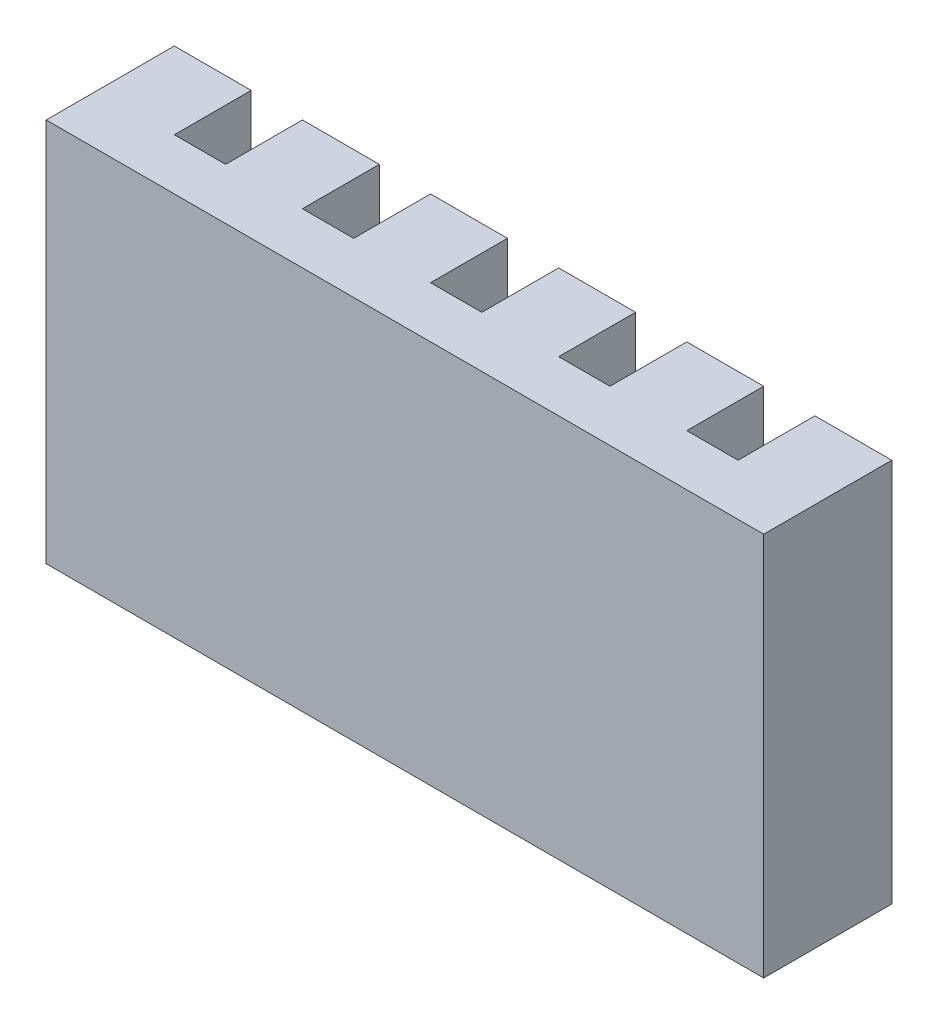
ISO-10303-21;
HEADER;
FILE_DESCRIPTION(('STEP AP214'),'2;1');
FILE_NAME('part.step','',(''),(''),'','','');
FILE_SCHEMA(('AUTOMOTIVE_DESIGN { 1 0 10303 214 1 1 1 1 }'));
ENDSEC;
DATA;
#1=APPLICATION_CONTEXT('core data for automotive mechanical design processes');
#2=APPLICATION_PROTOCOL_DEFINITION('international standard','automotive_design',2000,#1);
#3=PRODUCT_CONTEXT('',#1,'mechanical');
#4=PRODUCT('Part','Part','',(#3));
#5=PRODUCT_RELATED_PRODUCT_CATEGORY('part','',(#4));
#6=PRODUCT_DEFINITION_FORMATION('','',#4);
#7=PRODUCT_DEFINITION_CONTEXT('part definition',#1,'design');
#8=PRODUCT_DEFINITION('design','',#6,#7);
#9=PRODUCT_DEFINITION_SHAPE('','',#8);
#10=(LENGTH_UNIT() NAMED_UNIT(*) SI_UNIT(.MILLI.,.METRE.));
#11=(NAMED_UNIT(*) PLANE_ANGLE_UNIT() SI_UNIT($,.RADIAN.));
#12=(NAMED_UNIT(*) SI_UNIT($,.STERADIAN.) SOLID_ANGLE_UNIT());
#13=UNCERTAINTY_MEASURE_WITH_UNIT(LENGTH_MEASURE(1.E-05),#10,'distance_accuracy_value','');
#14=(GEOMETRIC_REPRESENTATION_CONTEXT(3) GLOBAL_UNCERTAINTY_ASSIGNED_CONTEXT((#13)) GLOBAL_UNIT_ASSIGNED_CONTEXT((#10,
#11,#12)) REPRESENTATION_CONTEXT('',''));
#15=CARTESIAN_POINT('',(0.,0.,0.));
#16=DIRECTION('',(0.,0.,1.));
#17=DIRECTION('',(1.,0.,0.));
#18=AXIS2_PLACEMENT_3D('',#15,#16,#17);
#19=CARTESIAN_POINT('',(14.,7.5,-5.));
#20=DIRECTION('',(0.,0.,1.));
#21=DIRECTION('',(1.,0.,0.));
#22=AXIS2_PLACEMENT_3D('',#19,#20,#21);
#23=PLANE('',#22);
#24=DIRECTION('',(-1.,0.,0.));
#25=VECTOR('',#24,1.);
#26=CARTESIAN_POINT('',(14.,-7.5,-5.));
#27=LINE('',#26,#25);
#28=CARTESIAN_POINT('',(14.,-7.5,-5.));
#29=VERTEX_POINT('',#28);
#30=CARTESIAN_POINT('',(11.,-7.5,-5.00000000000001));
#31=VERTEX_POINT('',#30);
#32=EDGE_CURVE('E233',#29,#31,#27,.T.);
#33=ORIENTED_EDGE('',*,*,#32,.T.);
#34=DIRECTION('',(0.,-1.,0.));
#35=VECTOR('',#34,1.);
#36=CARTESIAN_POINT('',(11.,7.5,-5.00000000000001));
#37=LINE('',#36,#35);
#38=CARTESIAN_POINT('',(11.,7.5,-5.00000000000001));
#39=VERTEX_POINT('',#38);
#40=EDGE_CURVE('E11',#39,#31,#37,.T.);
#41=ORIENTED_EDGE('',*,*,#40,.F.);
#42=DIRECTION('',(-1.,0.,0.));
#43=VECTOR('',#42,1.);
#44=CARTESIAN_POINT('',(14.,7.5,-5.));
#45=LINE('',#44,#43);
#46=CARTESIAN_POINT('',(14.,7.5,-5.));
#47=VERTEX_POINT('',#46);
#48=EDGE_CURVE('E279',#47,#39,#45,.T.);
#49=ORIENTED_EDGE('',*,*,#48,.F.);
#50=DIRECTION('',(0.,-1.,0.));
#51=VECTOR('',#50,1.);
#52=CARTESIAN_POINT('',(14.,7.5,-5.));
#53=LINE('',#52,#51);
#54=EDGE_CURVE('E229',#47,#29,#53,.T.);
#55=ORIENTED_EDGE('',*,*,#54,.T.);
#56=EDGE_LOOP('',(#33,#41,#49,#55));
#57=FACE_BOUND('',#56,.T.);
#58=ADVANCED_FACE('F41',(#57),#23,.F.);
#59=CARTESIAN_POINT('',(11.,7.5,-5.00000000000001));
#60=DIRECTION('',(1.,0.,0.));
#61=DIRECTION('',(0.,0.,-1.));
#62=AXIS2_PLACEMENT_3D('',#59,#60,#61);
#63=PLANE('',#62);
#64=DIRECTION('',(0.,0.,1.));
#65=VECTOR('',#64,1.);
#66=CARTESIAN_POINT('',(11.,-7.5,-5.00000000000001));
#67=LINE('',#66,#65);
#68=CARTESIAN_POINT('',(11.,-7.5,-2.00000000000001));
#69=VERTEX_POINT('',#68);
#70=EDGE_CURVE('E236',#31,#69,#67,.T.);
#71=ORIENTED_EDGE('',*,*,#70,.T.);
#72=DIRECTION('',(0.,-1.,0.));
#73=VECTOR('',#72,1.);
#74=CARTESIAN_POINT('',(11.,7.5,-2.00000000000001));
#75=LINE('',#74,#73);
#76=CARTESIAN_POINT('',(11.,7.5,-2.00000000000001));
#77=VERTEX_POINT('',#76);
#78=EDGE_CURVE('E49',#77,#69,#75,.T.);
#79=ORIENTED_EDGE('',*,*,#78,.F.);
#80=DIRECTION('',(0.,0.,1.));
#81=VECTOR('',#80,1.);
#82=CARTESIAN_POINT('',(11.,7.5,-5.00000000000001));
#83=LINE('',#82,#81);
#84=EDGE_CURVE('E148',#39,#77,#83,.T.);
#85=ORIENTED_EDGE('',*,*,#84,.F.);
#86=ORIENTED_EDGE('',*,*,#40,.T.);
#87=EDGE_LOOP('',(#71,#79,#85,#86));
#88=FACE_BOUND('',#87,.T.);
#89=ADVANCED_FACE('F417',(#88),#63,.F.);
#90=CARTESIAN_POINT('',(11.,7.5,-2.00000000000001));
#91=DIRECTION('',(0.,0.,1.));
#92=DIRECTION('',(1.,0.,0.));
#93=AXIS2_PLACEMENT_3D('',#90,#91,#92);
#94=PLANE('',#93);
#95=DIRECTION('',(-1.,0.,0.));
#96=VECTOR('',#95,1.);
#97=CARTESIAN_POINT('',(11.,-7.5,-2.00000000000001));
#98=LINE('',#97,#96);
#99=CARTESIAN_POINT('',(9.,-7.5,-2.));
#100=VERTEX_POINT('',#99);
#101=EDGE_CURVE('E238',#69,#100,#98,.T.);
#102=ORIENTED_EDGE('',*,*,#101,.T.);
#103=DIRECTION('',(0.,-1.,0.));
#104=VECTOR('',#103,1.);
#105=CARTESIAN_POINT('',(9.,7.5,-2.));
#106=LINE('',#105,#104);
#107=CARTESIAN_POINT('',(9.,7.5,-2.));
#108=VERTEX_POINT('',#107);
#109=EDGE_CURVE('E334',#108,#100,#106,.T.);
#110=ORIENTED_EDGE('',*,*,#109,.F.);
#111=DIRECTION('',(-1.,0.,0.));
#112=VECTOR('',#111,1.);
#113=CARTESIAN_POINT('',(11.,7.5,-2.00000000000001));
#114=LINE('',#113,#112);
#115=EDGE_CURVE('E342',#77,#108,#114,.T.);
#116=ORIENTED_EDGE('',*,*,#115,.F.);
#117=ORIENTED_EDGE('',*,*,#78,.T.);
#118=EDGE_LOOP('',(#102,#110,#116,#117));
#119=FACE_BOUND('',#118,.T.);
#120=ADVANCED_FACE('F340',(#119),#94,.F.);
#121=CARTESIAN_POINT('',(9.,7.5,-2.));
#122=DIRECTION('',(-1.,0.,0.));
#123=DIRECTION('',(0.,0.,1.));
#124=AXIS2_PLACEMENT_3D('',#121,#122,#123);
#125=PLANE('',#124);
#126=DIRECTION('',(0.,0.,-1.));
#127=VECTOR('',#126,1.);
#128=CARTESIAN_POINT('',(9.,-7.5,-2.));
#129=LINE('',#128,#127);
#130=CARTESIAN_POINT('',(9.,-7.5,-5.));
#131=VERTEX_POINT('',#130);
#132=EDGE_CURVE('E240',#100,#131,#129,.T.);
#133=ORIENTED_EDGE('',*,*,#132,.T.);
#134=DIRECTION('',(0.,-1.,0.));
#135=VECTOR('',#134,1.);
#136=CARTESIAN_POINT('',(9.,7.5,-5.));
#137=LINE('',#136,#135);
#138=CARTESIAN_POINT('',(9.,7.5,-5.));
#139=VERTEX_POINT('',#138);
#140=EDGE_CURVE('E331',#139,#131,#137,.T.);
#141=ORIENTED_EDGE('',*,*,#140,.F.);
#142=DIRECTION('',(0.,0.,-1.));
#143=VECTOR('',#142,1.);
#144=CARTESIAN_POINT('',(9.,7.5,-2.));
#145=LINE('',#144,#143);
#146=EDGE_CURVE('E360',#108,#139,#145,.T.);
#147=ORIENTED_EDGE('',*,*,#146,.F.);
#148=ORIENTED_EDGE('',*,*,#109,.T.);
#149=EDGE_LOOP('',(#133,#141,#147,#148));
#150=FACE_BOUND('',#149,.T.);
#151=ADVANCED_FACE('F351',(#150),#125,.F.);
#152=CARTESIAN_POINT('',(6.,7.5,-5.));
#153=DIRECTION('',(0.,0.,1.));
#154=DIRECTION('',(1.,0.,0.));
#155=AXIS2_PLACEMENT_3D('',#152,#153,#154);
#156=PLANE('',#155);
#157=DIRECTION('',(-1.,0.,0.));
#158=VECTOR('',#157,1.);
#159=CARTESIAN_POINT('',(6.,-7.5,-5.));
#160=LINE('',#159,#158);
#161=CARTESIAN_POINT('',(6.,-7.5,-5.));
#162=VERTEX_POINT('',#161);
#163=EDGE_CURVE('E242',#131,#162,#160,.T.);
#164=ORIENTED_EDGE('',*,*,#163,.T.);
#165=DIRECTION('',(0.,-1.,0.));
#166=VECTOR('',#165,1.);
#167=CARTESIAN_POINT('',(6.,7.5,-5.));
#168=LINE('',#167,#166);
#169=CARTESIAN_POINT('',(6.,7.5,-5.));
#170=VERTEX_POINT('',#169);
#171=EDGE_CURVE('E328',#170,#162,#168,.T.);
#172=ORIENTED_EDGE('',*,*,#171,.F.);
#173=DIRECTION('',(-1.,0.,0.));
#174=VECTOR('',#173,1.);
#175=CARTESIAN_POINT('',(6.,7.5,-5.));
#176=LINE('',#175,#174);
#177=EDGE_CURVE('E357',#139,#170,#176,.T.);
#178=ORIENTED_EDGE('',*,*,#177,.F.);
#179=ORIENTED_EDGE('',*,*,#140,.T.);
#180=EDGE_LOOP('',(#164,#172,#178,#179));
#181=FACE_BOUND('',#180,.T.);
#182=ADVANCED_FACE('F355',(#181),#156,.F.);
#183=CARTESIAN_POINT('',(6.,7.5,-2.));
#184=DIRECTION('',(1.,0.,0.));
#185=DIRECTION('',(0.,0.,-1.));
#186=AXIS2_PLACEMENT_3D('',#183,#184,#185);
#187=PLANE('',#186);
#188=DIRECTION('',(0.,0.,1.));
#189=VECTOR('',#188,1.);
#190=CARTESIAN_POINT('',(6.,-7.5,-2.));
#191=LINE('',#190,#189);
#192=CARTESIAN_POINT('',(6.,-7.5,-2.));
#193=VERTEX_POINT('',#192);
#194=EDGE_CURVE('E244',#162,#193,#191,.T.);
#195=ORIENTED_EDGE('',*,*,#194,.T.);
#196=DIRECTION('',(0.,-1.,0.));
#197=VECTOR('',#196,1.);
#198=CARTESIAN_POINT('',(6.,7.5,-2.));
#199=LINE('',#198,#197);
#200=CARTESIAN_POINT('',(6.,7.5,-2.));
#201=VERTEX_POINT('',#200);
#202=EDGE_CURVE('E325',#201,#193,#199,.T.);
#203=ORIENTED_EDGE('',*,*,#202,.F.);
#204=DIRECTION('',(0.,0.,1.));
#205=VECTOR('',#204,1.);
#206=CARTESIAN_POINT('',(6.,7.5,-2.));
#207=LINE('',#206,#205);
#208=EDGE_CURVE('E359',#170,#201,#207,.T.);
#209=ORIENTED_EDGE('',*,*,#208,.F.);
#210=ORIENTED_EDGE('',*,*,#171,.T.);
#211=EDGE_LOOP('',(#195,#203,#209,#210));
#212=FACE_BOUND('',#211,.T.);
#213=ADVANCED_FACE('F430',(#212),#187,.F.);
#214=CARTESIAN_POINT('',(4.,7.5,-2.));
#215=DIRECTION('',(0.,0.,1.));
#216=DIRECTION('',(1.,0.,0.));
#217=AXIS2_PLACEMENT_3D('',#214,#215,#216);
#218=PLANE('',#217);
#219=DIRECTION('',(-1.,0.,0.));
#220=VECTOR('',#219,1.);
#221=CARTESIAN_POINT('',(4.,-7.5,-2.));
#222=LINE('',#221,#220);
#223=CARTESIAN_POINT('',(4.,-7.5,-2.));
#224=VERTEX_POINT('',#223);
#225=EDGE_CURVE('E246',#193,#224,#222,.T.);
#226=ORIENTED_EDGE('',*,*,#225,.T.);
#227=DIRECTION('',(0.,-1.,0.));
#228=VECTOR('',#227,1.);
#229=CARTESIAN_POINT('',(4.,7.5,-2.));
#230=LINE('',#229,#228);
#231=CARTESIAN_POINT('',(4.,7.5,-2.));
#232=VERTEX_POINT('',#231);
#233=EDGE_CURVE('E322',#232,#224,#230,.T.);
#234=ORIENTED_EDGE('',*,*,#233,.F.);
#235=DIRECTION('',(-1.,0.,0.));
#236=VECTOR('',#235,1.);
#237=CARTESIAN_POINT('',(4.,7.5,-2.));
#238=LINE('',#237,#236);
#239=EDGE_CURVE('E362',#201,#232,#238,.T.);
#240=ORIENTED_EDGE('',*,*,#239,.F.);
#241=ORIENTED_EDGE('',*,*,#202,.T.);
#242=EDGE_LOOP('',(#226,#234,#240,#241));
#243=FACE_BOUND('',#242,.T.);
#244=ADVANCED_FACE('F433',(#243),#218,.F.);
#245=CARTESIAN_POINT('',(4.,7.5,-5.));
#246=DIRECTION('',(-1.,0.,0.));
#247=DIRECTION('',(0.,0.,1.));
#248=AXIS2_PLACEMENT_3D('',#245,#246,#247);
#249=PLANE('',#248);
#250=DIRECTION('',(0.,0.,-1.));
#251=VECTOR('',#250,1.);
#252=CARTESIAN_POINT('',(4.,-7.5,-5.));
#253=LINE('',#252,#251);
#254=CARTESIAN_POINT('',(4.,-7.5,-5.));
#255=VERTEX_POINT('',#254);
#256=EDGE_CURVE('E248',#224,#255,#253,.T.);
#257=ORIENTED_EDGE('',*,*,#256,.T.);
#258=DIRECTION('',(0.,-1.,0.));
#259=VECTOR('',#258,1.);
#260=CARTESIAN_POINT('',(4.,7.5,-5.));
#261=LINE('',#260,#259);
#262=CARTESIAN_POINT('',(4.,7.5,-5.));
#263=VERTEX_POINT('',#262);
#264=EDGE_CURVE('E319',#263,#255,#261,.T.);
#265=ORIENTED_EDGE('',*,*,#264,.F.);
#266=DIRECTION('',(0.,0.,-1.));
#267=VECTOR('',#266,1.);
#268=CARTESIAN_POINT('',(4.,7.5,-5.));
#269=LINE('',#268,#267);
#270=EDGE_CURVE('E368',#232,#263,#269,.T.);
#271=ORIENTED_EDGE('',*,*,#270,.F.);
#272=ORIENTED_EDGE('',*,*,#233,.T.);
#273=EDGE_LOOP('',(#257,#265,#271,#272));
#274=FACE_BOUND('',#273,.T.);
#275=ADVANCED_FACE('F437',(#274),#249,.F.);
#276=CARTESIAN_POINT('',(0.999999999999997,7.5,-5.));
#277=DIRECTION('',(0.,0.,1.));
#278=DIRECTION('',(1.,0.,0.));
#279=AXIS2_PLACEMENT_3D('',#276,#277,#278);
#280=PLANE('',#279);
#281=DIRECTION('',(-1.,0.,0.));
#282=VECTOR('',#281,1.);
#283=CARTESIAN_POINT('',(0.999999999999997,-7.5,-5.));
#284=LINE('',#283,#282);
#285=CARTESIAN_POINT('',(0.999999999999997,-7.5,-5.));
#286=VERTEX_POINT('',#285);
#287=EDGE_CURVE('E250',#255,#286,#284,.T.);
#288=ORIENTED_EDGE('',*,*,#287,.T.);
#289=DIRECTION('',(0.,-1.,0.));
#290=VECTOR('',#289,1.);
#291=CARTESIAN_POINT('',(0.999999999999997,7.5,-5.));
#292=LINE('',#291,#290);
#293=CARTESIAN_POINT('',(0.999999999999997,7.5,-5.));
#294=VERTEX_POINT('',#293);
#295=EDGE_CURVE('E316',#294,#286,#292,.T.);
#296=ORIENTED_EDGE('',*,*,#295,.F.);
#297=DIRECTION('',(-1.,0.,0.));
#298=VECTOR('',#297,1.);
#299=CARTESIAN_POINT('',(0.999999999999997,7.5,-5.));
#300=LINE('',#299,#298);
#301=EDGE_CURVE('E370',#263,#294,#300,.T.);
#302=ORIENTED_EDGE('',*,*,#301,.F.);
#303=ORIENTED_EDGE('',*,*,#264,.T.);
#304=EDGE_LOOP('',(#288,#296,#302,#303));
#305=FACE_BOUND('',#304,.T.);
#306=ADVANCED_FACE('F441',(#305),#280,.F.);
#307=CARTESIAN_POINT('',(1.,7.5,-2.));
#308=DIRECTION('',(1.,0.,0.));
#309=DIRECTION('',(0.,0.,-1.));
#310=AXIS2_PLACEMENT_3D('',#307,#308,#309);
#311=PLANE('',#310);
#312=DIRECTION('',(0.,0.,1.));
#313=VECTOR('',#312,1.);
#314=CARTESIAN_POINT('',(1.,-7.5,-2.));
#315=LINE('',#314,#313);
#316=CARTESIAN_POINT('',(1.,-7.5,-2.));
#317=VERTEX_POINT('',#316);
#318=EDGE_CURVE('E252',#286,#317,#315,.T.);
#319=ORIENTED_EDGE('',*,*,#318,.T.);
#320=DIRECTION('',(0.,-1.,0.));
#321=VECTOR('',#320,1.);
#322=CARTESIAN_POINT('',(1.,7.5,-2.));
#323=LINE('',#322,#321);
#324=CARTESIAN_POINT('',(1.,7.5,-2.));
#325=VERTEX_POINT('',#324);
#326=EDGE_CURVE('E313',#325,#317,#323,.T.);
#327=ORIENTED_EDGE('',*,*,#326,.F.);
#328=DIRECTION('',(0.,0.,1.));
#329=VECTOR('',#328,1.);
#330=CARTESIAN_POINT('',(1.,7.5,-2.));
#331=LINE('',#330,#329);
#332=EDGE_CURVE('E372',#294,#325,#331,.T.);
#333=ORIENTED_EDGE('',*,*,#332,.F.);
#334=ORIENTED_EDGE('',*,*,#295,.T.);
#335=EDGE_LOOP('',(#319,#327,#333,#334));
#336=FACE_BOUND('',#335,.T.);
#337=ADVANCED_FACE('F445',(#336),#311,.F.);
#338=CARTESIAN_POINT('',(-1.,7.5,-2.));
#339=DIRECTION('',(0.,0.,1.));
#340=DIRECTION('',(1.,0.,0.));
#341=AXIS2_PLACEMENT_3D('',#338,#339,#340);
#342=PLANE('',#341);
#343=DIRECTION('',(-1.,0.,0.));
#344=VECTOR('',#343,1.);
#345=CARTESIAN_POINT('',(-1.,-7.5,-2.));
#346=LINE('',#345,#344);
#347=CARTESIAN_POINT('',(-1.,-7.5,-2.));
#348=VERTEX_POINT('',#347);
#349=EDGE_CURVE('E254',#317,#348,#346,.T.);
#350=ORIENTED_EDGE('',*,*,#349,.T.);
#351=DIRECTION('',(0.,-1.,0.));
#352=VECTOR('',#351,1.);
#353=CARTESIAN_POINT('',(-1.,7.5,-2.));
#354=LINE('',#353,#352);
#355=CARTESIAN_POINT('',(-1.,7.5,-2.));
#356=VERTEX_POINT('',#355);
#357=EDGE_CURVE('E310',#356,#348,#354,.T.);
#358=ORIENTED_EDGE('',*,*,#357,.F.);
#359=DIRECTION('',(-1.,0.,0.));
#360=VECTOR('',#359,1.);
#361=CARTESIAN_POINT('',(-1.,7.5,-2.));
#362=LINE('',#361,#360);
#363=EDGE_CURVE('E374',#325,#356,#362,.T.);
#364=ORIENTED_EDGE('',*,*,#363,.F.);
#365=ORIENTED_EDGE('',*,*,#326,.T.);
#366=EDGE_LOOP('',(#350,#358,#364,#365));
#367=FACE_BOUND('',#366,.T.);
#368=ADVANCED_FACE('F449',(#367),#342,.F.);
#369=CARTESIAN_POINT('',(-1.,7.5,-2.));
#370=DIRECTION('',(-1.,0.,0.));
#371=DIRECTION('',(0.,0.,1.));
#372=AXIS2_PLACEMENT_3D('',#369,#370,#371);
#373=PLANE('',#372);
#374=DIRECTION('',(0.,0.,-1.));
#375=VECTOR('',#374,1.);
#376=CARTESIAN_POINT('',(-1.,-7.5,-2.));
#377=LINE('',#376,#375);
#378=CARTESIAN_POINT('',(-1.,-7.5,-5.));
#379=VERTEX_POINT('',#378);
#380=EDGE_CURVE('E256',#348,#379,#377,.T.);
#381=ORIENTED_EDGE('',*,*,#380,.T.);
#382=DIRECTION('',(0.,-1.,0.));
#383=VECTOR('',#382,1.);
#384=CARTESIAN_POINT('',(-1.,7.5,-5.));
#385=LINE('',#384,#383);
#386=CARTESIAN_POINT('',(-1.,7.5,-5.));
#387=VERTEX_POINT('',#386);
#388=EDGE_CURVE('E307',#387,#379,#385,.T.);
#389=ORIENTED_EDGE('',*,*,#388,.F.);
#390=DIRECTION('',(0.,0.,-1.));
#391=VECTOR('',#390,1.);
#392=CARTESIAN_POINT('',(-1.,7.5,-2.));
#393=LINE('',#392,#391);
#394=EDGE_CURVE('E376',#356,#387,#393,.T.);
#395=ORIENTED_EDGE('',*,*,#394,.F.);
#396=ORIENTED_EDGE('',*,*,#357,.T.);
#397=EDGE_LOOP('',(#381,#389,#395,#396));
#398=FACE_BOUND('',#397,.T.);
#399=ADVANCED_FACE('F453',(#398),#373,.F.);
#400=CARTESIAN_POINT('',(-1.,7.5,-5.));
#401=DIRECTION('',(0.,0.,1.));
#402=DIRECTION('',(1.,0.,0.));
#403=AXIS2_PLACEMENT_3D('',#400,#401,#402);
#404=PLANE('',#403);
#405=DIRECTION('',(-1.,0.,0.));
#406=VECTOR('',#405,1.);
#407=CARTESIAN_POINT('',(-1.,-7.5,-5.));
#408=LINE('',#407,#406);
#409=CARTESIAN_POINT('',(-4.,-7.5,-5.));
#410=VERTEX_POINT('',#409);
#411=EDGE_CURVE('E258',#379,#410,#408,.T.);
#412=ORIENTED_EDGE('',*,*,#411,.T.);
#413=DIRECTION('',(0.,-1.,0.));
#414=VECTOR('',#413,1.);
#415=CARTESIAN_POINT('',(-4.,7.5,-5.));
#416=LINE('',#415,#414);
#417=CARTESIAN_POINT('',(-4.,7.5,-5.));
#418=VERTEX_POINT('',#417);
#419=EDGE_CURVE('E304',#418,#410,#416,.T.);
#420=ORIENTED_EDGE('',*,*,#419,.F.);
#421=DIRECTION('',(-1.,0.,0.));
#422=VECTOR('',#421,1.);
#423=CARTESIAN_POINT('',(-1.,7.5,-5.));
#424=LINE('',#423,#422);
#425=EDGE_CURVE('E378',#387,#418,#424,.T.);
#426=ORIENTED_EDGE('',*,*,#425,.F.);
#427=ORIENTED_EDGE('',*,*,#388,.T.);
#428=EDGE_LOOP('',(#412,#420,#426,#427));
#429=FACE_BOUND('',#428,.T.);
#430=ADVANCED_FACE('F457',(#429),#404,.F.);
#431=CARTESIAN_POINT('',(-4.,7.5,-5.));
#432=DIRECTION('',(1.,0.,0.));
#433=DIRECTION('',(0.,0.,-1.));
#434=AXIS2_PLACEMENT_3D('',#431,#432,#433);
#435=PLANE('',#434);
#436=DIRECTION('',(0.,0.,1.));
#437=VECTOR('',#436,1.);
#438=CARTESIAN_POINT('',(-4.,-7.5,-5.));
#439=LINE('',#438,#437);
#440=CARTESIAN_POINT('',(-4.,-7.5,-2.));
#441=VERTEX_POINT('',#440);
#442=EDGE_CURVE('E260',#410,#441,#439,.T.);
#443=ORIENTED_EDGE('',*,*,#442,.T.);
#444=DIRECTION('',(0.,-1.,0.));
#445=VECTOR('',#444,1.);
#446=CARTESIAN_POINT('',(-4.,7.5,-2.));
#447=LINE('',#446,#445);
#448=CARTESIAN_POINT('',(-4.,7.5,-2.));
#449=VERTEX_POINT('',#448);
#450=EDGE_CURVE('E301',#449,#441,#447,.T.);
#451=ORIENTED_EDGE('',*,*,#450,.F.);
#452=DIRECTION('',(0.,0.,1.));
#453=VECTOR('',#452,1.);
#454=CARTESIAN_POINT('',(-4.,7.5,-5.));
#455=LINE('',#454,#453);
#456=EDGE_CURVE('E380',#418,#449,#455,.T.);
#457=ORIENTED_EDGE('',*,*,#456,.F.);
#458=ORIENTED_EDGE('',*,*,#419,.T.);
#459=EDGE_LOOP('',(#443,#451,#457,#458));
#460=FACE_BOUND('',#459,.T.);
#461=ADVANCED_FACE('F461',(#460),#435,.F.);
#462=CARTESIAN_POINT('',(-4.,7.5,-2.));
#463=DIRECTION('',(0.,0.,1.));
#464=DIRECTION('',(1.,0.,0.));
#465=AXIS2_PLACEMENT_3D('',#462,#463,#464);
#466=PLANE('',#465);
#467=DIRECTION('',(-1.,0.,0.));
#468=VECTOR('',#467,1.);
#469=CARTESIAN_POINT('',(-4.,-7.5,-2.));
#470=LINE('',#469,#468);
#471=CARTESIAN_POINT('',(-6.,-7.5,-2.));
#472=VERTEX_POINT('',#471);
#473=EDGE_CURVE('E262',#441,#472,#470,.T.);
#474=ORIENTED_EDGE('',*,*,#473,.T.);
#475=DIRECTION('',(0.,-1.,0.));
#476=VECTOR('',#475,1.);
#477=CARTESIAN_POINT('',(-6.,7.5,-2.));
#478=LINE('',#477,#476);
#479=CARTESIAN_POINT('',(-6.,7.5,-2.));
#480=VERTEX_POINT('',#479);
#481=EDGE_CURVE('E298',#480,#472,#478,.T.);
#482=ORIENTED_EDGE('',*,*,#481,.F.);
#483=DIRECTION('',(-1.,0.,0.));
#484=VECTOR('',#483,1.);
#485=CARTESIAN_POINT('',(-4.,7.5,-2.));
#486=LINE('',#485,#484);
#487=EDGE_CURVE('E382',#449,#480,#486,.T.);
#488=ORIENTED_EDGE('',*,*,#487,.F.);
#489=ORIENTED_EDGE('',*,*,#450,.T.);
#490=EDGE_LOOP('',(#474,#482,#488,#489));
#491=FACE_BOUND('',#490,.T.);
#492=ADVANCED_FACE('F465',(#491),#466,.F.);
#493=CARTESIAN_POINT('',(-6.,7.5,-2.));
#494=DIRECTION('',(-1.,0.,0.));
#495=DIRECTION('',(0.,0.,1.));
#496=AXIS2_PLACEMENT_3D('',#493,#494,#495);
#497=PLANE('',#496);
#498=DIRECTION('',(0.,0.,-1.));
#499=VECTOR('',#498,1.);
#500=CARTESIAN_POINT('',(-6.,-7.5,-2.));
#501=LINE('',#500,#499);
#502=CARTESIAN_POINT('',(-6.,-7.5,-5.));
#503=VERTEX_POINT('',#502);
#504=EDGE_CURVE('E264',#472,#503,#501,.T.);
#505=ORIENTED_EDGE('',*,*,#504,.T.);
#506=DIRECTION('',(0.,-1.,0.));
#507=VECTOR('',#506,1.);
#508=CARTESIAN_POINT('',(-6.,7.5,-5.));
#509=LINE('',#508,#507);
#510=CARTESIAN_POINT('',(-6.,7.5,-5.));
#511=VERTEX_POINT('',#510);
#512=EDGE_CURVE('E295',#511,#503,#509,.T.);
#513=ORIENTED_EDGE('',*,*,#512,.F.);
#514=DIRECTION('',(0.,0.,-1.));
#515=VECTOR('',#514,1.);
#516=CARTESIAN_POINT('',(-6.,7.5,-2.));
#517=LINE('',#516,#515);
#518=EDGE_CURVE('E384',#480,#511,#517,.T.);
#519=ORIENTED_EDGE('',*,*,#518,.F.);
#520=ORIENTED_EDGE('',*,*,#481,.T.);
#521=EDGE_LOOP('',(#505,#513,#519,#520));
#522=FACE_BOUND('',#521,.T.);
#523=ADVANCED_FACE('F469',(#522),#497,.F.);
#524=CARTESIAN_POINT('',(-6.,7.5,-5.));
#525=DIRECTION('',(0.,0.,1.));
#526=DIRECTION('',(1.,0.,0.));
#527=AXIS2_PLACEMENT_3D('',#524,#525,#526);
#528=PLANE('',#527);
#529=DIRECTION('',(-1.,0.,0.));
#530=VECTOR('',#529,1.);
#531=CARTESIAN_POINT('',(-6.,-7.5,-5.));
#532=LINE('',#531,#530);
#533=CARTESIAN_POINT('',(-9.,-7.5,-5.));
#534=VERTEX_POINT('',#533);
#535=EDGE_CURVE('E266',#503,#534,#532,.T.);
#536=ORIENTED_EDGE('',*,*,#535,.T.);
#537=DIRECTION('',(0.,-1.,0.));
#538=VECTOR('',#537,1.);
#539=CARTESIAN_POINT('',(-9.,7.5,-5.));
#540=LINE('',#539,#538);
#541=CARTESIAN_POINT('',(-9.,7.5,-5.));
#542=VERTEX_POINT('',#541);
#543=EDGE_CURVE('E292',#542,#534,#540,.T.);
#544=ORIENTED_EDGE('',*,*,#543,.F.);
#545=DIRECTION('',(-1.,0.,0.));
#546=VECTOR('',#545,1.);
#547=CARTESIAN_POINT('',(-6.,7.5,-5.));
#548=LINE('',#547,#546);
#549=EDGE_CURVE('E386',#511,#542,#548,.T.);
#550=ORIENTED_EDGE('',*,*,#549,.F.);
#551=ORIENTED_EDGE('',*,*,#512,.T.);
#552=EDGE_LOOP('',(#536,#544,#550,#551));
#553=FACE_BOUND('',#552,.T.);
#554=ADVANCED_FACE('F473',(#553),#528,.F.);
#555=CARTESIAN_POINT('',(-9.,7.5,-5.));
#556=DIRECTION('',(1.,0.,0.));
#557=DIRECTION('',(0.,0.,-1.));
#558=AXIS2_PLACEMENT_3D('',#555,#556,#557);
#559=PLANE('',#558);
#560=DIRECTION('',(0.,0.,1.));
#561=VECTOR('',#560,1.);
#562=CARTESIAN_POINT('',(-9.,-7.5,-5.));
#563=LINE('',#562,#561);
#564=CARTESIAN_POINT('',(-9.,-7.5,-2.));
#565=VERTEX_POINT('',#564);
#566=EDGE_CURVE('E268',#534,#565,#563,.T.);
#567=ORIENTED_EDGE('',*,*,#566,.T.);
#568=DIRECTION('',(0.,-1.,0.));
#569=VECTOR('',#568,1.);
#570=CARTESIAN_POINT('',(-9.,7.5,-2.));
#571=LINE('',#570,#569);
#572=CARTESIAN_POINT('',(-9.,7.5,-2.));
#573=VERTEX_POINT('',#572);
#574=EDGE_CURVE('E289',#573,#565,#571,.T.);
#575=ORIENTED_EDGE('',*,*,#574,.F.);
#576=DIRECTION('',(0.,0.,1.));
#577=VECTOR('',#576,1.);
#578=CARTESIAN_POINT('',(-9.,7.5,-5.));
#579=LINE('',#578,#577);
#580=EDGE_CURVE('E388',#542,#573,#579,.T.);
#581=ORIENTED_EDGE('',*,*,#580,.F.);
#582=ORIENTED_EDGE('',*,*,#543,.T.);
#583=EDGE_LOOP('',(#567,#575,#581,#582));
#584=FACE_BOUND('',#583,.T.);
#585=ADVANCED_FACE('F477',(#584),#559,.F.);
#586=CARTESIAN_POINT('',(-9.,7.5,-2.));
#587=DIRECTION('',(0.,0.,1.));
#588=DIRECTION('',(1.,0.,0.));
#589=AXIS2_PLACEMENT_3D('',#586,#587,#588);
#590=PLANE('',#589);
#591=DIRECTION('',(-1.,0.,0.));
#592=VECTOR('',#591,1.);
#593=CARTESIAN_POINT('',(-9.,-7.5,-2.));
#594=LINE('',#593,#592);
#595=CARTESIAN_POINT('',(-11.,-7.5,-2.));
#596=VERTEX_POINT('',#595);
#597=EDGE_CURVE('E270',#565,#596,#594,.T.);
#598=ORIENTED_EDGE('',*,*,#597,.T.);
#599=DIRECTION('',(0.,-1.,0.));
#600=VECTOR('',#599,1.);
#601=CARTESIAN_POINT('',(-11.,7.5,-2.));
#602=LINE('',#601,#600);
#603=CARTESIAN_POINT('',(-11.,7.5,-2.));
#604=VERTEX_POINT('',#603);
#605=EDGE_CURVE('E286',#604,#596,#602,.T.);
#606=ORIENTED_EDGE('',*,*,#605,.F.);
#607=DIRECTION('',(-1.,0.,0.));
#608=VECTOR('',#607,1.);
#609=CARTESIAN_POINT('',(-9.,7.5,-2.));
#610=LINE('',#609,#608);
#611=EDGE_CURVE('E390',#573,#604,#610,.T.);
#612=ORIENTED_EDGE('',*,*,#611,.F.);
#613=ORIENTED_EDGE('',*,*,#574,.T.);
#614=EDGE_LOOP('',(#598,#606,#612,#613));
#615=FACE_BOUND('',#614,.T.);
#616=ADVANCED_FACE('F481',(#615),#590,.F.);
#617=CARTESIAN_POINT('',(-11.,7.5,-2.));
#618=DIRECTION('',(-1.,0.,0.));
#619=DIRECTION('',(0.,0.,1.));
#620=AXIS2_PLACEMENT_3D('',#617,#618,#619);
#621=PLANE('',#620);
#622=DIRECTION('',(0.,0.,-1.));
#623=VECTOR('',#622,1.);
#624=CARTESIAN_POINT('',(-11.,-7.5,-2.));
#625=LINE('',#624,#623);
#626=CARTESIAN_POINT('',(-11.,-7.5,-5.));
#627=VERTEX_POINT('',#626);
#628=EDGE_CURVE('E272',#596,#627,#625,.T.);
#629=ORIENTED_EDGE('',*,*,#628,.T.);
#630=DIRECTION('',(0.,-1.,0.));
#631=VECTOR('',#630,1.);
#632=CARTESIAN_POINT('',(-11.,7.5,-5.));
#633=LINE('',#632,#631);
#634=CARTESIAN_POINT('',(-11.,7.5,-5.));
#635=VERTEX_POINT('',#634);
#636=EDGE_CURVE('E283',#635,#627,#633,.T.);
#637=ORIENTED_EDGE('',*,*,#636,.F.);
#638=DIRECTION('',(0.,0.,-1.));
#639=VECTOR('',#638,1.);
#640=CARTESIAN_POINT('',(-11.,7.5,-2.));
#641=LINE('',#640,#639);
#642=EDGE_CURVE('E392',#604,#635,#641,.T.);
#643=ORIENTED_EDGE('',*,*,#642,.F.);
#644=ORIENTED_EDGE('',*,*,#605,.T.);
#645=EDGE_LOOP('',(#629,#637,#643,#644));
#646=FACE_BOUND('',#645,.T.);
#647=ADVANCED_FACE('F398',(#646),#621,.F.);
#648=CARTESIAN_POINT('',(-11.,7.5,-5.));
#649=DIRECTION('',(0.,0.,1.));
#650=DIRECTION('',(1.,0.,0.));
#651=AXIS2_PLACEMENT_3D('',#648,#649,#650);
#652=PLANE('',#651);
#653=DIRECTION('',(-1.,0.,0.));
#654=VECTOR('',#653,1.);
#655=CARTESIAN_POINT('',(-11.,-7.5,-5.));
#656=LINE('',#655,#654);
#657=CARTESIAN_POINT('',(-14.,-7.5,-5.));
#658=VERTEX_POINT('',#657);
#659=EDGE_CURVE('E274',#627,#658,#656,.T.);
#660=ORIENTED_EDGE('',*,*,#659,.T.);
#661=DIRECTION('',(0.,-1.,0.));
#662=VECTOR('',#661,1.);
#663=CARTESIAN_POINT('',(-14.,7.5,-5.));
#664=LINE('',#663,#662);
#665=CARTESIAN_POINT('',(-14.,7.5,-5.));
#666=VERTEX_POINT('',#665);
#667=EDGE_CURVE('E224',#666,#658,#664,.T.);
#668=ORIENTED_EDGE('',*,*,#667,.F.);
#669=DIRECTION('',(-1.,0.,0.));
#670=VECTOR('',#669,1.);
#671=CARTESIAN_POINT('',(-11.,7.5,-5.));
#672=LINE('',#671,#670);
#673=EDGE_CURVE('E215',#635,#666,#672,.T.);
#674=ORIENTED_EDGE('',*,*,#673,.F.);
#675=ORIENTED_EDGE('',*,*,#636,.T.);
#676=EDGE_LOOP('',(#660,#668,#674,#675));
#677=FACE_BOUND('',#676,.T.);
#678=ADVANCED_FACE('F402',(#677),#652,.F.);
#679=CARTESIAN_POINT('',(-14.,7.5,-5.));
#680=DIRECTION('',(1.,0.,0.));
#681=DIRECTION('',(0.,0.,-1.));
#682=AXIS2_PLACEMENT_3D('',#679,#680,#681);
#683=PLANE('',#682);
#684=DIRECTION('',(0.,0.,1.));
#685=VECTOR('',#684,1.);
#686=CARTESIAN_POINT('',(-14.,-7.5,-5.));
#687=LINE('',#686,#685);
#688=CARTESIAN_POINT('',(-14.,-7.5,0.));
#689=VERTEX_POINT('',#688);
#690=EDGE_CURVE('E223',#658,#689,#687,.T.);
#691=ORIENTED_EDGE('',*,*,#690,.T.);
#692=DIRECTION('',(0.,-1.,0.));
#693=VECTOR('',#692,1.);
#694=CARTESIAN_POINT('',(-14.,7.5,0.));
#695=LINE('',#694,#693);
#696=CARTESIAN_POINT('',(-14.,7.5,0.));
#697=VERTEX_POINT('',#696);
#698=EDGE_CURVE('E220',#697,#689,#695,.T.);
#699=ORIENTED_EDGE('',*,*,#698,.F.);
#700=DIRECTION('',(0.,0.,1.));
#701=VECTOR('',#700,1.);
#702=CARTESIAN_POINT('',(-14.,7.5,-5.));
#703=LINE('',#702,#701);
#704=EDGE_CURVE('E209',#666,#697,#703,.T.);
#705=ORIENTED_EDGE('',*,*,#704,.F.);
#706=ORIENTED_EDGE('',*,*,#667,.T.);
#707=EDGE_LOOP('',(#691,#699,#705,#706));
#708=FACE_BOUND('',#707,.T.);
#709=ADVANCED_FACE('F221',(#708),#683,.F.);
#710=CARTESIAN_POINT('',(-14.,7.5,0.));
#711=DIRECTION('',(0.,0.,-1.));
#712=DIRECTION('',(-1.,0.,0.));
#713=AXIS2_PLACEMENT_3D('',#710,#711,#712);
#714=PLANE('',#713);
#715=DIRECTION('',(1.,0.,0.));
#716=VECTOR('',#715,1.);
#717=CARTESIAN_POINT('',(-14.,-7.5,0.));
#718=LINE('',#717,#716);
#719=CARTESIAN_POINT('',(14.,-7.5,0.));
#720=VERTEX_POINT('',#719);
#721=EDGE_CURVE('E134',#689,#720,#718,.T.);
#722=ORIENTED_EDGE('',*,*,#721,.T.);
#723=DIRECTION('',(0.,-1.,0.));
#724=VECTOR('',#723,1.);
#725=CARTESIAN_POINT('',(14.,7.5,0.));
#726=LINE('',#725,#724);
#727=CARTESIAN_POINT('',(14.,7.5,0.));
#728=VERTEX_POINT('',#727);
#729=EDGE_CURVE('E225',#728,#720,#726,.T.);
#730=ORIENTED_EDGE('',*,*,#729,.F.);
#731=DIRECTION('',(1.,0.,0.));
#732=VECTOR('',#731,1.);
#733=CARTESIAN_POINT('',(-14.,7.5,0.));
#734=LINE('',#733,#732);
#735=EDGE_CURVE('E213',#697,#728,#734,.T.);
#736=ORIENTED_EDGE('',*,*,#735,.F.);
#737=ORIENTED_EDGE('',*,*,#698,.T.);
#738=EDGE_LOOP('',(#722,#730,#736,#737));
#739=FACE_BOUND('',#738,.T.);
#740=ADVANCED_FACE('F227',(#739),#714,.F.);
#741=CARTESIAN_POINT('',(14.,7.5,0.));
#742=DIRECTION('',(-1.,0.,0.));
#743=DIRECTION('',(0.,0.,1.));
#744=AXIS2_PLACEMENT_3D('',#741,#742,#743);
#745=PLANE('',#744);
#746=DIRECTION('',(0.,0.,-1.));
#747=VECTOR('',#746,1.);
#748=CARTESIAN_POINT('',(14.,-7.5,0.));
#749=LINE('',#748,#747);
#750=EDGE_CURVE('E140',#720,#29,#749,.T.);
#751=ORIENTED_EDGE('',*,*,#750,.T.);
#752=ORIENTED_EDGE('',*,*,#54,.F.);
#753=DIRECTION('',(0.,0.,-1.));
#754=VECTOR('',#753,1.);
#755=CARTESIAN_POINT('',(14.,7.5,0.));
#756=LINE('',#755,#754);
#757=EDGE_CURVE('E57',#728,#47,#756,.T.);
#758=ORIENTED_EDGE('',*,*,#757,.F.);
#759=ORIENTED_EDGE('',*,*,#729,.T.);
#760=EDGE_LOOP('',(#751,#752,#758,#759));
#761=FACE_BOUND('',#760,.T.);
#762=ADVANCED_FACE('F406',(#761),#745,.F.);
#763=CARTESIAN_POINT('',(0.,7.5,0.));
#764=DIRECTION('',(0.,1.,0.));
#765=DIRECTION('',(0.,0.,1.));
#766=AXIS2_PLACEMENT_3D('',#763,#764,#765);
#767=PLANE('',#766);
#768=ORIENTED_EDGE('',*,*,#48,.T.);
#769=ORIENTED_EDGE('',*,*,#84,.T.);
#770=ORIENTED_EDGE('',*,*,#115,.T.);
#771=ORIENTED_EDGE('',*,*,#146,.T.);
#772=ORIENTED_EDGE('',*,*,#177,.T.);
#773=ORIENTED_EDGE('',*,*,#208,.T.);
#774=ORIENTED_EDGE('',*,*,#239,.T.);
#775=ORIENTED_EDGE('',*,*,#270,.T.);
#776=ORIENTED_EDGE('',*,*,#301,.T.);
#777=ORIENTED_EDGE('',*,*,#332,.T.);
#778=ORIENTED_EDGE('',*,*,#363,.T.);
#779=ORIENTED_EDGE('',*,*,#394,.T.);
#780=ORIENTED_EDGE('',*,*,#425,.T.);
#781=ORIENTED_EDGE('',*,*,#456,.T.);
#782=ORIENTED_EDGE('',*,*,#487,.T.);
#783=ORIENTED_EDGE('',*,*,#518,.T.);
#784=ORIENTED_EDGE('',*,*,#549,.T.);
#785=ORIENTED_EDGE('',*,*,#580,.T.);
#786=ORIENTED_EDGE('',*,*,#611,.T.);
#787=ORIENTED_EDGE('',*,*,#642,.T.);
#788=ORIENTED_EDGE('',*,*,#673,.T.);
#789=ORIENTED_EDGE('',*,*,#704,.T.);
#790=ORIENTED_EDGE('',*,*,#735,.T.);
#791=ORIENTED_EDGE('',*,*,#757,.T.);
#792=EDGE_LOOP('',(#768,#769,#770,#771,#772,#773,#774,#775,#776,#777,#778,#779,#780,#781,#782,
#783,#784,#785,#786,#787,#788,#789,#790,#791));
#793=FACE_BOUND('',#792,.T.);
#794=ADVANCED_FACE('F211',(#793),#767,.T.);
#795=CARTESIAN_POINT('',(0.,-7.5,0.));
#796=DIRECTION('',(0.,1.,0.));
#797=DIRECTION('',(0.,0.,1.));
#798=AXIS2_PLACEMENT_3D('',#795,#796,#797);
#799=PLANE('',#798);
#800=ORIENTED_EDGE('',*,*,#32,.F.);
#801=ORIENTED_EDGE('',*,*,#750,.F.);
#802=ORIENTED_EDGE('',*,*,#721,.F.);
#803=ORIENTED_EDGE('',*,*,#690,.F.);
#804=ORIENTED_EDGE('',*,*,#659,.F.);
#805=ORIENTED_EDGE('',*,*,#628,.F.);
#806=ORIENTED_EDGE('',*,*,#597,.F.);
#807=ORIENTED_EDGE('',*,*,#566,.F.);
#808=ORIENTED_EDGE('',*,*,#535,.F.);
#809=ORIENTED_EDGE('',*,*,#504,.F.);
#810=ORIENTED_EDGE('',*,*,#473,.F.);
#811=ORIENTED_EDGE('',*,*,#442,.F.);
#812=ORIENTED_EDGE('',*,*,#411,.F.);
#813=ORIENTED_EDGE('',*,*,#380,.F.);
#814=ORIENTED_EDGE('',*,*,#349,.F.);
#815=ORIENTED_EDGE('',*,*,#318,.F.);
#816=ORIENTED_EDGE('',*,*,#287,.F.);
#817=ORIENTED_EDGE('',*,*,#256,.F.);
#818=ORIENTED_EDGE('',*,*,#225,.F.);
#819=ORIENTED_EDGE('',*,*,#194,.F.);
#820=ORIENTED_EDGE('',*,*,#163,.F.);
#821=ORIENTED_EDGE('',*,*,#132,.F.);
#822=ORIENTED_EDGE('',*,*,#101,.F.);
#823=ORIENTED_EDGE('',*,*,#70,.F.);
#824=EDGE_LOOP('',(#800,#801,#802,#803,#804,#805,#806,#807,#808,#809,#810,#811,#812,#813,#814,
#815,#816,#817,#818,#819,#820,#821,#822,#823));
#825=FACE_BOUND('',#824,.T.);
#826=ADVANCED_FACE('F346',(#825),#799,.F.);
#827=CLOSED_SHELL('',(#58,#89,#120,#151,#182,#213,#244,#275,#306,#337,#368,#399,#430,#461,#492,
#523,#554,#585,#616,#647,#678,#709,#740,#762,#794,#826));
#828=MANIFOLD_SOLID_BREP('B2',#827);
#829=ADVANCED_BREP_SHAPE_REPRESENTATION('',(#18,#828),#14);
#830=SHAPE_DEFINITION_REPRESENTATION(#9,#829);
ENDSEC;
END-ISO-10303-21;
